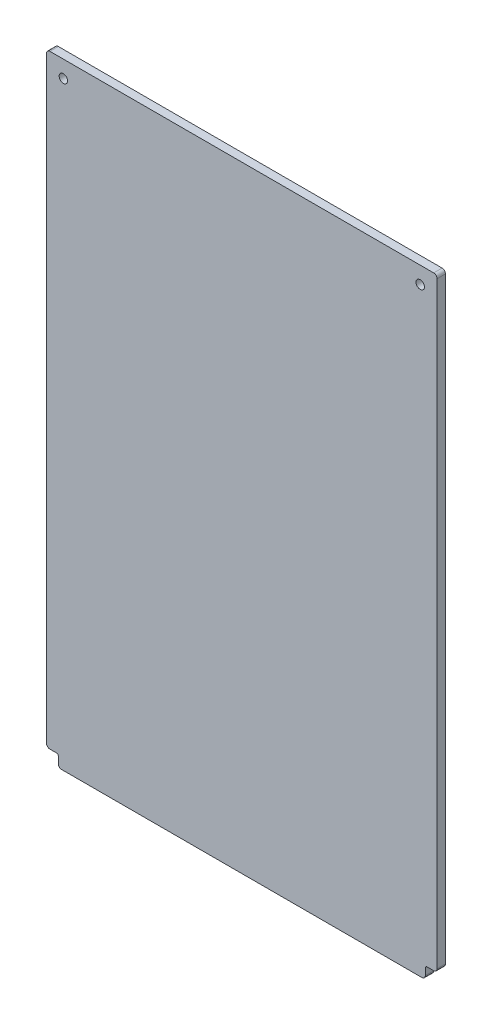
ISO-10303-21;
HEADER;
FILE_DESCRIPTION(('STEP AP214'),'2;1');
FILE_NAME('part.step','',(''),(''),'','','');
FILE_SCHEMA(('AUTOMOTIVE_DESIGN { 1 0 10303 214 1 1 1 1 }'));
ENDSEC;
DATA;
#1=APPLICATION_CONTEXT('core data for automotive mechanical design processes');
#2=APPLICATION_PROTOCOL_DEFINITION('international standard','automotive_design',2000,#1);
#3=PRODUCT_CONTEXT('',#1,'mechanical');
#4=PRODUCT('Part','Part','',(#3));
#5=PRODUCT_RELATED_PRODUCT_CATEGORY('part','',(#4));
#6=PRODUCT_DEFINITION_FORMATION('','',#4);
#7=PRODUCT_DEFINITION_CONTEXT('part definition',#1,'design');
#8=PRODUCT_DEFINITION('design','',#6,#7);
#9=PRODUCT_DEFINITION_SHAPE('','',#8);
#10=(LENGTH_UNIT() NAMED_UNIT(*) SI_UNIT(.MILLI.,.METRE.));
#11=(NAMED_UNIT(*) PLANE_ANGLE_UNIT() SI_UNIT($,.RADIAN.));
#12=(NAMED_UNIT(*) SI_UNIT($,.STERADIAN.) SOLID_ANGLE_UNIT());
#13=UNCERTAINTY_MEASURE_WITH_UNIT(LENGTH_MEASURE(1.E-05),#10,'distance_accuracy_value','');
#14=(GEOMETRIC_REPRESENTATION_CONTEXT(3) GLOBAL_UNCERTAINTY_ASSIGNED_CONTEXT((#13)) GLOBAL_UNIT_ASSIGNED_CONTEXT((#10,
#11,#12)) REPRESENTATION_CONTEXT('',''));
#15=CARTESIAN_POINT('',(0.,0.,0.));
#16=DIRECTION('',(0.,0.,1.));
#17=DIRECTION('',(1.,0.,0.));
#18=AXIS2_PLACEMENT_3D('',#15,#16,#17);
#19=CARTESIAN_POINT('',(0.,0.,6.35));
#20=DIRECTION('',(0.,0.,1.));
#21=DIRECTION('',(1.,0.,0.));
#22=AXIS2_PLACEMENT_3D('',#19,#20,#21);
#23=PLANE('',#22);
#24=CARTESIAN_POINT('',(12.6999999999999,452.12,6.35));
#25=DIRECTION('',(0.,0.,1.));
#26=DIRECTION('',(1.,0.,0.));
#27=AXIS2_PLACEMENT_3D('',#24,#25,#26);
#28=CIRCLE('',#27,3.175);
#29=CARTESIAN_POINT('',(15.8749999999999,452.12,6.35));
#30=VERTEX_POINT('',#29);
#31=EDGE_CURVE('E285',#30,#30,#28,.T.);
#32=ORIENTED_EDGE('',*,*,#31,.F.);
#33=EDGE_LOOP('',(#32));
#34=FACE_BOUND('',#33,.T.);
#35=DIRECTION('',(0.,-1.,0.));
#36=VECTOR('',#35,1.);
#37=CARTESIAN_POINT('',(0.,464.82,6.35));
#38=LINE('',#37,#36);
#39=CARTESIAN_POINT('',(0.,462.28,6.35));
#40=VERTEX_POINT('',#39);
#41=CARTESIAN_POINT('',(0.,11.43,6.35));
#42=VERTEX_POINT('',#41);
#43=EDGE_CURVE('E193',#40,#42,#38,.T.);
#44=ORIENTED_EDGE('',*,*,#43,.T.);
#45=CARTESIAN_POINT('',(2.54,11.43,6.35));
#46=DIRECTION('',(0.,0.,1.));
#47=DIRECTION('',(1.,0.,0.));
#48=AXIS2_PLACEMENT_3D('',#45,#46,#47);
#49=CIRCLE('',#48,2.54);
#50=CARTESIAN_POINT('',(2.54,8.89,6.35));
#51=VERTEX_POINT('',#50);
#52=EDGE_CURVE('E235',#42,#51,#49,.T.);
#53=ORIENTED_EDGE('',*,*,#52,.T.);
#54=DIRECTION('',(1.,0.,0.));
#55=VECTOR('',#54,1.);
#56=CARTESIAN_POINT('',(0.,8.89,6.35));
#57=LINE('',#56,#55);
#58=CARTESIAN_POINT('',(7.62,8.89,6.35));
#59=VERTEX_POINT('',#58);
#60=EDGE_CURVE('E302',#51,#59,#57,.T.);
#61=ORIENTED_EDGE('',*,*,#60,.T.);
#62=CARTESIAN_POINT('',(7.62,7.62,6.35));
#63=DIRECTION('',(0.,0.,1.));
#64=DIRECTION('',(1.,0.,0.));
#65=AXIS2_PLACEMENT_3D('',#62,#63,#64);
#66=CIRCLE('',#65,1.27);
#67=CARTESIAN_POINT('',(8.89,7.62,6.35));
#68=VERTEX_POINT('',#67);
#69=EDGE_CURVE('E158',#59,#68,#66,.F.);
#70=ORIENTED_EDGE('',*,*,#69,.T.);
#71=DIRECTION('',(0.,-1.,0.));
#72=VECTOR('',#71,1.);
#73=CARTESIAN_POINT('',(8.89,8.89,6.35));
#74=LINE('',#73,#72);
#75=CARTESIAN_POINT('',(8.89,2.54,6.35));
#76=VERTEX_POINT('',#75);
#77=EDGE_CURVE('E168',#68,#76,#74,.T.);
#78=ORIENTED_EDGE('',*,*,#77,.T.);
#79=CARTESIAN_POINT('',(11.43,2.54,6.35));
#80=DIRECTION('',(0.,0.,1.));
#81=DIRECTION('',(1.,0.,0.));
#82=AXIS2_PLACEMENT_3D('',#79,#80,#81);
#83=CIRCLE('',#82,2.54);
#84=CARTESIAN_POINT('',(11.43,0.,6.35));
#85=VERTEX_POINT('',#84);
#86=EDGE_CURVE('E233',#76,#85,#83,.T.);
#87=ORIENTED_EDGE('',*,*,#86,.T.);
#88=DIRECTION('',(1.,0.,0.));
#89=VECTOR('',#88,1.);
#90=CARTESIAN_POINT('',(8.89,0.,6.35));
#91=LINE('',#90,#89);
#92=CARTESIAN_POINT('',(283.21,0.,6.35));
#93=VERTEX_POINT('',#92);
#94=EDGE_CURVE('E305',#85,#93,#91,.T.);
#95=ORIENTED_EDGE('',*,*,#94,.T.);
#96=CARTESIAN_POINT('',(283.21,2.54,6.35));
#97=DIRECTION('',(0.,0.,1.));
#98=DIRECTION('',(1.,0.,0.));
#99=AXIS2_PLACEMENT_3D('',#96,#97,#98);
#100=CIRCLE('',#99,2.54);
#101=CARTESIAN_POINT('',(285.75,2.54,6.35));
#102=VERTEX_POINT('',#101);
#103=EDGE_CURVE('E231',#93,#102,#100,.T.);
#104=ORIENTED_EDGE('',*,*,#103,.T.);
#105=DIRECTION('',(0.,1.,0.));
#106=VECTOR('',#105,1.);
#107=CARTESIAN_POINT('',(285.75,0.,6.35));
#108=LINE('',#107,#106);
#109=CARTESIAN_POINT('',(285.75,7.62,6.35));
#110=VERTEX_POINT('',#109);
#111=EDGE_CURVE('E268',#102,#110,#108,.T.);
#112=ORIENTED_EDGE('',*,*,#111,.T.);
#113=CARTESIAN_POINT('',(287.02,7.62,6.35));
#114=DIRECTION('',(0.,0.,1.));
#115=DIRECTION('',(1.,0.,0.));
#116=AXIS2_PLACEMENT_3D('',#113,#114,#115);
#117=CIRCLE('',#116,1.27);
#118=CARTESIAN_POINT('',(287.02,8.89,6.35));
#119=VERTEX_POINT('',#118);
#120=EDGE_CURVE('E205',#110,#119,#117,.F.);
#121=ORIENTED_EDGE('',*,*,#120,.T.);
#122=DIRECTION('',(1.,0.,0.));
#123=VECTOR('',#122,1.);
#124=CARTESIAN_POINT('',(285.75,8.89,6.35));
#125=LINE('',#124,#123);
#126=CARTESIAN_POINT('',(292.1,8.89,6.35));
#127=VERTEX_POINT('',#126);
#128=EDGE_CURVE('E258',#119,#127,#125,.T.);
#129=ORIENTED_EDGE('',*,*,#128,.T.);
#130=CARTESIAN_POINT('',(292.1,11.43,6.35));
#131=DIRECTION('',(0.,0.,1.));
#132=DIRECTION('',(1.,0.,0.));
#133=AXIS2_PLACEMENT_3D('',#130,#131,#132);
#134=CIRCLE('',#133,2.54);
#135=CARTESIAN_POINT('',(294.64,11.43,6.35));
#136=VERTEX_POINT('',#135);
#137=EDGE_CURVE('E229',#127,#136,#134,.T.);
#138=ORIENTED_EDGE('',*,*,#137,.T.);
#139=DIRECTION('',(0.,1.,0.));
#140=VECTOR('',#139,1.);
#141=CARTESIAN_POINT('',(294.64,8.89,6.35));
#142=LINE('',#141,#140);
#143=CARTESIAN_POINT('',(294.64,462.28,6.35));
#144=VERTEX_POINT('',#143);
#145=EDGE_CURVE('E267',#136,#144,#142,.T.);
#146=ORIENTED_EDGE('',*,*,#145,.T.);
#147=CARTESIAN_POINT('',(292.1,462.28,6.35));
#148=DIRECTION('',(0.,0.,1.));
#149=DIRECTION('',(1.,0.,0.));
#150=AXIS2_PLACEMENT_3D('',#147,#148,#149);
#151=CIRCLE('',#150,2.54);
#152=CARTESIAN_POINT('',(292.1,464.82,6.35));
#153=VERTEX_POINT('',#152);
#154=EDGE_CURVE('E54',#144,#153,#151,.T.);
#155=ORIENTED_EDGE('',*,*,#154,.T.);
#156=DIRECTION('',(-1.,0.,0.));
#157=VECTOR('',#156,1.);
#158=CARTESIAN_POINT('',(0.,464.82,6.35));
#159=LINE('',#158,#157);
#160=CARTESIAN_POINT('',(2.53999999999991,464.82,6.35));
#161=VERTEX_POINT('',#160);
#162=EDGE_CURVE('E169',#153,#161,#159,.T.);
#163=ORIENTED_EDGE('',*,*,#162,.T.);
#164=CARTESIAN_POINT('',(2.53999999999991,462.28,6.35));
#165=DIRECTION('',(0.,0.,1.));
#166=DIRECTION('',(1.,0.,0.));
#167=AXIS2_PLACEMENT_3D('',#164,#165,#166);
#168=CIRCLE('',#167,2.54);
#169=EDGE_CURVE('E226',#161,#40,#168,.T.);
#170=ORIENTED_EDGE('',*,*,#169,.T.);
#171=EDGE_LOOP('',(#44,#53,#61,#70,#78,#87,#95,#104,#112,#121,#129,#138,#146,#155,#163,#170));
#172=FACE_BOUND('',#171,.T.);
#173=CARTESIAN_POINT('',(281.94,452.12,6.35));
#174=DIRECTION('',(0.,0.,1.));
#175=DIRECTION('',(1.,0.,0.));
#176=AXIS2_PLACEMENT_3D('',#173,#174,#175);
#177=CIRCLE('',#176,3.17499999999997);
#178=CARTESIAN_POINT('',(285.115,452.12,6.35));
#179=VERTEX_POINT('',#178);
#180=EDGE_CURVE('E295',#179,#179,#177,.T.);
#181=ORIENTED_EDGE('',*,*,#180,.F.);
#182=EDGE_LOOP('',(#181));
#183=FACE_BOUND('',#182,.T.);
#184=ADVANCED_FACE('F33',(#34,#172,#183),#23,.T.);
#185=CARTESIAN_POINT('',(0.,0.,0.));
#186=DIRECTION('',(0.,0.,1.));
#187=DIRECTION('',(1.,0.,0.));
#188=AXIS2_PLACEMENT_3D('',#185,#186,#187);
#189=PLANE('',#188);
#190=DIRECTION('',(1.,0.,0.));
#191=VECTOR('',#190,1.);
#192=CARTESIAN_POINT('',(0.,8.89,0.));
#193=LINE('',#192,#191);
#194=CARTESIAN_POINT('',(2.54,8.89,0.));
#195=VERTEX_POINT('',#194);
#196=CARTESIAN_POINT('',(7.62,8.89,0.));
#197=VERTEX_POINT('',#196);
#198=EDGE_CURVE('E176',#195,#197,#193,.T.);
#199=ORIENTED_EDGE('',*,*,#198,.F.);
#200=CARTESIAN_POINT('',(2.54,11.43,0.));
#201=DIRECTION('',(0.,0.,1.));
#202=DIRECTION('',(1.,0.,0.));
#203=AXIS2_PLACEMENT_3D('',#200,#201,#202);
#204=CIRCLE('',#203,2.54);
#205=CARTESIAN_POINT('',(0.,11.43,0.));
#206=VERTEX_POINT('',#205);
#207=EDGE_CURVE('E219',#195,#206,#204,.F.);
#208=ORIENTED_EDGE('',*,*,#207,.T.);
#209=DIRECTION('',(0.,-1.,0.));
#210=VECTOR('',#209,1.);
#211=CARTESIAN_POINT('',(0.,464.82,0.));
#212=LINE('',#211,#210);
#213=CARTESIAN_POINT('',(0.,462.28,0.));
#214=VERTEX_POINT('',#213);
#215=EDGE_CURVE('E181',#214,#206,#212,.T.);
#216=ORIENTED_EDGE('',*,*,#215,.F.);
#217=CARTESIAN_POINT('',(2.53999999999991,462.28,0.));
#218=DIRECTION('',(0.,0.,1.));
#219=DIRECTION('',(1.,0.,0.));
#220=AXIS2_PLACEMENT_3D('',#217,#218,#219);
#221=CIRCLE('',#220,2.54);
#222=CARTESIAN_POINT('',(2.53999999999991,464.82,0.));
#223=VERTEX_POINT('',#222);
#224=EDGE_CURVE('E210',#214,#223,#221,.F.);
#225=ORIENTED_EDGE('',*,*,#224,.T.);
#226=DIRECTION('',(-1.,0.,0.));
#227=VECTOR('',#226,1.);
#228=CARTESIAN_POINT('',(0.,464.82,0.));
#229=LINE('',#228,#227);
#230=CARTESIAN_POINT('',(292.1,464.82,0.));
#231=VERTEX_POINT('',#230);
#232=EDGE_CURVE('E192',#231,#223,#229,.T.);
#233=ORIENTED_EDGE('',*,*,#232,.F.);
#234=CARTESIAN_POINT('',(292.1,462.28,0.));
#235=DIRECTION('',(0.,0.,1.));
#236=DIRECTION('',(1.,0.,0.));
#237=AXIS2_PLACEMENT_3D('',#234,#235,#236);
#238=CIRCLE('',#237,2.54);
#239=CARTESIAN_POINT('',(294.64,462.28,0.));
#240=VERTEX_POINT('',#239);
#241=EDGE_CURVE('E212',#231,#240,#238,.F.);
#242=ORIENTED_EDGE('',*,*,#241,.T.);
#243=DIRECTION('',(0.,1.,0.));
#244=VECTOR('',#243,1.);
#245=CARTESIAN_POINT('',(294.64,8.89,0.));
#246=LINE('',#245,#244);
#247=CARTESIAN_POINT('',(294.64,11.43,0.));
#248=VERTEX_POINT('',#247);
#249=EDGE_CURVE('E189',#248,#240,#246,.T.);
#250=ORIENTED_EDGE('',*,*,#249,.F.);
#251=CARTESIAN_POINT('',(292.1,11.43,0.));
#252=DIRECTION('',(0.,0.,1.));
#253=DIRECTION('',(1.,0.,0.));
#254=AXIS2_PLACEMENT_3D('',#251,#252,#253);
#255=CIRCLE('',#254,2.54);
#256=CARTESIAN_POINT('',(292.1,8.89,0.));
#257=VERTEX_POINT('',#256);
#258=EDGE_CURVE('E214',#248,#257,#255,.F.);
#259=ORIENTED_EDGE('',*,*,#258,.T.);
#260=DIRECTION('',(1.,0.,0.));
#261=VECTOR('',#260,1.);
#262=CARTESIAN_POINT('',(285.75,8.89,0.));
#263=LINE('',#262,#261);
#264=CARTESIAN_POINT('',(287.02,8.89,0.));
#265=VERTEX_POINT('',#264);
#266=EDGE_CURVE('E186',#265,#257,#263,.T.);
#267=ORIENTED_EDGE('',*,*,#266,.F.);
#268=CARTESIAN_POINT('',(287.02,7.62,0.));
#269=DIRECTION('',(0.,0.,1.));
#270=DIRECTION('',(1.,0.,0.));
#271=AXIS2_PLACEMENT_3D('',#268,#269,#270);
#272=CIRCLE('',#271,1.27);
#273=CARTESIAN_POINT('',(285.75,7.62,0.));
#274=VERTEX_POINT('',#273);
#275=EDGE_CURVE('E202',#265,#274,#272,.T.);
#276=ORIENTED_EDGE('',*,*,#275,.T.);
#277=DIRECTION('',(0.,1.,0.));
#278=VECTOR('',#277,1.);
#279=CARTESIAN_POINT('',(285.75,0.,0.));
#280=LINE('',#279,#278);
#281=CARTESIAN_POINT('',(285.75,2.54,0.));
#282=VERTEX_POINT('',#281);
#283=EDGE_CURVE('E179',#282,#274,#280,.T.);
#284=ORIENTED_EDGE('',*,*,#283,.F.);
#285=CARTESIAN_POINT('',(283.21,2.54,0.));
#286=DIRECTION('',(0.,0.,1.));
#287=DIRECTION('',(1.,0.,0.));
#288=AXIS2_PLACEMENT_3D('',#285,#286,#287);
#289=CIRCLE('',#288,2.54);
#290=CARTESIAN_POINT('',(283.21,0.,0.));
#291=VERTEX_POINT('',#290);
#292=EDGE_CURVE('E216',#282,#291,#289,.F.);
#293=ORIENTED_EDGE('',*,*,#292,.T.);
#294=DIRECTION('',(1.,0.,0.));
#295=VECTOR('',#294,1.);
#296=CARTESIAN_POINT('',(8.89,0.,0.));
#297=LINE('',#296,#295);
#298=CARTESIAN_POINT('',(11.43,0.,0.));
#299=VERTEX_POINT('',#298);
#300=EDGE_CURVE('E175',#299,#291,#297,.T.);
#301=ORIENTED_EDGE('',*,*,#300,.F.);
#302=CARTESIAN_POINT('',(11.43,2.54,0.));
#303=DIRECTION('',(0.,0.,1.));
#304=DIRECTION('',(1.,0.,0.));
#305=AXIS2_PLACEMENT_3D('',#302,#303,#304);
#306=CIRCLE('',#305,2.54);
#307=CARTESIAN_POINT('',(8.89,2.54,0.));
#308=VERTEX_POINT('',#307);
#309=EDGE_CURVE('E174',#299,#308,#306,.F.);
#310=ORIENTED_EDGE('',*,*,#309,.T.);
#311=DIRECTION('',(0.,-1.,0.));
#312=VECTOR('',#311,1.);
#313=CARTESIAN_POINT('',(8.89,8.89,0.));
#314=LINE('',#313,#312);
#315=CARTESIAN_POINT('',(8.89,7.62,0.));
#316=VERTEX_POINT('',#315);
#317=EDGE_CURVE('E165',#316,#308,#314,.T.);
#318=ORIENTED_EDGE('',*,*,#317,.F.);
#319=CARTESIAN_POINT('',(7.62,7.62,0.));
#320=DIRECTION('',(0.,0.,1.));
#321=DIRECTION('',(1.,0.,0.));
#322=AXIS2_PLACEMENT_3D('',#319,#320,#321);
#323=CIRCLE('',#322,1.27);
#324=EDGE_CURVE('E148',#316,#197,#323,.T.);
#325=ORIENTED_EDGE('',*,*,#324,.T.);
#326=EDGE_LOOP('',(#199,#208,#216,#225,#233,#242,#250,#259,#267,#276,#284,#293,#301,#310,#318,#325));
#327=FACE_BOUND('',#326,.T.);
#328=CARTESIAN_POINT('',(12.6999999999999,452.12,0.));
#329=DIRECTION('',(0.,0.,1.));
#330=DIRECTION('',(1.,0.,0.));
#331=AXIS2_PLACEMENT_3D('',#328,#329,#330);
#332=CIRCLE('',#331,3.175);
#333=CARTESIAN_POINT('',(15.8749999999999,452.12,0.));
#334=VERTEX_POINT('',#333);
#335=EDGE_CURVE('E290',#334,#334,#332,.T.);
#336=ORIENTED_EDGE('',*,*,#335,.T.);
#337=EDGE_LOOP('',(#336));
#338=FACE_BOUND('',#337,.T.);
#339=CARTESIAN_POINT('',(281.94,452.12,0.));
#340=DIRECTION('',(0.,0.,1.));
#341=DIRECTION('',(1.,0.,0.));
#342=AXIS2_PLACEMENT_3D('',#339,#340,#341);
#343=CIRCLE('',#342,3.17499999999997);
#344=CARTESIAN_POINT('',(285.115,452.12,0.));
#345=VERTEX_POINT('',#344);
#346=EDGE_CURVE('E298',#345,#345,#343,.T.);
#347=ORIENTED_EDGE('',*,*,#346,.T.);
#348=EDGE_LOOP('',(#347));
#349=FACE_BOUND('',#348,.T.);
#350=ADVANCED_FACE('F171',(#327,#338,#349),#189,.F.);
#351=CARTESIAN_POINT('',(0.,464.82,6.35));
#352=DIRECTION('',(1.,0.,0.));
#353=DIRECTION('',(0.,1.,0.));
#354=AXIS2_PLACEMENT_3D('',#351,#352,#353);
#355=PLANE('',#354);
#356=ORIENTED_EDGE('',*,*,#215,.T.);
#357=DIRECTION('',(0.,0.,-1.));
#358=VECTOR('',#357,1.);
#359=CARTESIAN_POINT('',(0.,11.43,6.35));
#360=LINE('',#359,#358);
#361=EDGE_CURVE('E224',#206,#42,#360,.F.);
#362=ORIENTED_EDGE('',*,*,#361,.T.);
#363=ORIENTED_EDGE('',*,*,#43,.F.);
#364=DIRECTION('',(0.,0.,-1.));
#365=VECTOR('',#364,1.);
#366=CARTESIAN_POINT('',(0.,462.28,6.35));
#367=LINE('',#366,#365);
#368=EDGE_CURVE('E221',#40,#214,#367,.T.);
#369=ORIENTED_EDGE('',*,*,#368,.T.);
#370=EDGE_LOOP('',(#356,#362,#363,#369));
#371=FACE_BOUND('',#370,.T.);
#372=ADVANCED_FACE('F341',(#371),#355,.F.);
#373=CARTESIAN_POINT('',(0.,8.89,6.35));
#374=DIRECTION('',(0.,1.,0.));
#375=DIRECTION('',(0.,0.,1.));
#376=AXIS2_PLACEMENT_3D('',#373,#374,#375);
#377=PLANE('',#376);
#378=ORIENTED_EDGE('',*,*,#60,.F.);
#379=DIRECTION('',(0.,0.,-1.));
#380=VECTOR('',#379,1.);
#381=CARTESIAN_POINT('',(2.54,8.89,6.35));
#382=LINE('',#381,#380);
#383=EDGE_CURVE('E207',#51,#195,#382,.T.);
#384=ORIENTED_EDGE('',*,*,#383,.T.);
#385=ORIENTED_EDGE('',*,*,#198,.T.);
#386=DIRECTION('',(0.,0.,-1.));
#387=VECTOR('',#386,1.);
#388=CARTESIAN_POINT('',(7.62,8.89,6.35));
#389=LINE('',#388,#387);
#390=EDGE_CURVE('E154',#197,#59,#389,.F.);
#391=ORIENTED_EDGE('',*,*,#390,.T.);
#392=EDGE_LOOP('',(#378,#384,#385,#391));
#393=FACE_BOUND('',#392,.T.);
#394=ADVANCED_FACE('F359',(#393),#377,.F.);
#395=CARTESIAN_POINT('',(8.89,8.89,6.35));
#396=DIRECTION('',(1.,0.,0.));
#397=DIRECTION('',(0.,0.,-1.));
#398=AXIS2_PLACEMENT_3D('',#395,#396,#397);
#399=PLANE('',#398);
#400=ORIENTED_EDGE('',*,*,#317,.T.);
#401=DIRECTION('',(0.,0.,-1.));
#402=VECTOR('',#401,1.);
#403=CARTESIAN_POINT('',(8.89,2.54,6.35));
#404=LINE('',#403,#402);
#405=EDGE_CURVE('E242',#308,#76,#404,.F.);
#406=ORIENTED_EDGE('',*,*,#405,.T.);
#407=ORIENTED_EDGE('',*,*,#77,.F.);
#408=DIRECTION('',(0.,0.,-1.));
#409=VECTOR('',#408,1.);
#410=CARTESIAN_POINT('',(8.89,7.62,0.));
#411=LINE('',#410,#409);
#412=EDGE_CURVE('E152',#68,#316,#411,.T.);
#413=ORIENTED_EDGE('',*,*,#412,.T.);
#414=EDGE_LOOP('',(#400,#406,#407,#413));
#415=FACE_BOUND('',#414,.T.);
#416=ADVANCED_FACE('F164',(#415),#399,.F.);
#417=CARTESIAN_POINT('',(8.89,0.,6.35));
#418=DIRECTION('',(0.,1.,0.));
#419=DIRECTION('',(0.,0.,1.));
#420=AXIS2_PLACEMENT_3D('',#417,#418,#419);
#421=PLANE('',#420);
#422=ORIENTED_EDGE('',*,*,#94,.F.);
#423=DIRECTION('',(0.,0.,-1.));
#424=VECTOR('',#423,1.);
#425=CARTESIAN_POINT('',(11.43,0.,6.35));
#426=LINE('',#425,#424);
#427=EDGE_CURVE('E239',#85,#299,#426,.T.);
#428=ORIENTED_EDGE('',*,*,#427,.T.);
#429=ORIENTED_EDGE('',*,*,#300,.T.);
#430=DIRECTION('',(0.,0.,-1.));
#431=VECTOR('',#430,1.);
#432=CARTESIAN_POINT('',(283.21,0.,6.35));
#433=LINE('',#432,#431);
#434=EDGE_CURVE('E237',#291,#93,#433,.F.);
#435=ORIENTED_EDGE('',*,*,#434,.T.);
#436=EDGE_LOOP('',(#422,#428,#429,#435));
#437=FACE_BOUND('',#436,.T.);
#438=ADVANCED_FACE('F321',(#437),#421,.F.);
#439=CARTESIAN_POINT('',(285.75,0.,6.35));
#440=DIRECTION('',(-1.,0.,0.));
#441=DIRECTION('',(0.,0.,1.));
#442=AXIS2_PLACEMENT_3D('',#439,#440,#441);
#443=PLANE('',#442);
#444=ORIENTED_EDGE('',*,*,#111,.F.);
#445=DIRECTION('',(0.,0.,-1.));
#446=VECTOR('',#445,1.);
#447=CARTESIAN_POINT('',(285.75,2.54,6.35));
#448=LINE('',#447,#446);
#449=EDGE_CURVE('E244',#102,#282,#448,.T.);
#450=ORIENTED_EDGE('',*,*,#449,.T.);
#451=ORIENTED_EDGE('',*,*,#283,.T.);
#452=DIRECTION('',(0.,0.,-1.));
#453=VECTOR('',#452,1.);
#454=CARTESIAN_POINT('',(285.75,7.62,6.35));
#455=LINE('',#454,#453);
#456=EDGE_CURVE('E159',#274,#110,#455,.F.);
#457=ORIENTED_EDGE('',*,*,#456,.T.);
#458=EDGE_LOOP('',(#444,#450,#451,#457));
#459=FACE_BOUND('',#458,.T.);
#460=ADVANCED_FACE('F313',(#459),#443,.F.);
#461=CARTESIAN_POINT('',(285.75,8.89,6.35));
#462=DIRECTION('',(0.,1.,0.));
#463=DIRECTION('',(0.,0.,1.));
#464=AXIS2_PLACEMENT_3D('',#461,#462,#463);
#465=PLANE('',#464);
#466=ORIENTED_EDGE('',*,*,#266,.T.);
#467=DIRECTION('',(0.,0.,-1.));
#468=VECTOR('',#467,1.);
#469=CARTESIAN_POINT('',(292.1,8.89,6.35));
#470=LINE('',#469,#468);
#471=EDGE_CURVE('E252',#257,#127,#470,.F.);
#472=ORIENTED_EDGE('',*,*,#471,.T.);
#473=ORIENTED_EDGE('',*,*,#128,.F.);
#474=DIRECTION('',(0.,0.,-1.));
#475=VECTOR('',#474,1.);
#476=CARTESIAN_POINT('',(287.02,8.89,0.));
#477=LINE('',#476,#475);
#478=EDGE_CURVE('E196',#119,#265,#477,.T.);
#479=ORIENTED_EDGE('',*,*,#478,.T.);
#480=EDGE_LOOP('',(#466,#472,#473,#479));
#481=FACE_BOUND('',#480,.T.);
#482=ADVANCED_FACE('F257',(#481),#465,.F.);
#483=CARTESIAN_POINT('',(294.64,8.89,6.35));
#484=DIRECTION('',(-1.,0.,0.));
#485=DIRECTION('',(0.,0.,1.));
#486=AXIS2_PLACEMENT_3D('',#483,#484,#485);
#487=PLANE('',#486);
#488=ORIENTED_EDGE('',*,*,#145,.F.);
#489=DIRECTION('',(0.,0.,-1.));
#490=VECTOR('',#489,1.);
#491=CARTESIAN_POINT('',(294.64,11.43,6.35));
#492=LINE('',#491,#490);
#493=EDGE_CURVE('E249',#136,#248,#492,.T.);
#494=ORIENTED_EDGE('',*,*,#493,.T.);
#495=ORIENTED_EDGE('',*,*,#249,.T.);
#496=DIRECTION('',(0.,0.,-1.));
#497=VECTOR('',#496,1.);
#498=CARTESIAN_POINT('',(294.64,462.28,6.35));
#499=LINE('',#498,#497);
#500=EDGE_CURVE('E247',#240,#144,#499,.F.);
#501=ORIENTED_EDGE('',*,*,#500,.T.);
#502=EDGE_LOOP('',(#488,#494,#495,#501));
#503=FACE_BOUND('',#502,.T.);
#504=ADVANCED_FACE('F274',(#503),#487,.F.);
#505=CARTESIAN_POINT('',(0.,464.82,6.35));
#506=DIRECTION('',(0.,-1.,0.));
#507=DIRECTION('',(0.,0.,-1.));
#508=AXIS2_PLACEMENT_3D('',#505,#506,#507);
#509=PLANE('',#508);
#510=ORIENTED_EDGE('',*,*,#162,.F.);
#511=DIRECTION('',(0.,0.,-1.));
#512=VECTOR('',#511,1.);
#513=CARTESIAN_POINT('',(292.1,464.82,6.35));
#514=LINE('',#513,#512);
#515=EDGE_CURVE('E11',#153,#231,#514,.T.);
#516=ORIENTED_EDGE('',*,*,#515,.T.);
#517=ORIENTED_EDGE('',*,*,#232,.T.);
#518=DIRECTION('',(0.,0.,-1.));
#519=VECTOR('',#518,1.);
#520=CARTESIAN_POINT('',(2.53999999999991,464.82,6.35));
#521=LINE('',#520,#519);
#522=EDGE_CURVE('E41',#223,#161,#521,.F.);
#523=ORIENTED_EDGE('',*,*,#522,.T.);
#524=EDGE_LOOP('',(#510,#516,#517,#523));
#525=FACE_BOUND('',#524,.T.);
#526=ADVANCED_FACE('F280',(#525),#509,.F.);
#527=CARTESIAN_POINT('',(12.6999999999999,452.12,6.35));
#528=DIRECTION('',(0.,0.,-1.));
#529=DIRECTION('',(-1.,0.,0.));
#530=AXIS2_PLACEMENT_3D('',#527,#528,#529);
#531=CYLINDRICAL_SURFACE('',#530,3.175);
#532=ORIENTED_EDGE('',*,*,#31,.T.);
#533=EDGE_LOOP('',(#532));
#534=FACE_BOUND('',#533,.T.);
#535=ORIENTED_EDGE('',*,*,#335,.F.);
#536=EDGE_LOOP('',(#535));
#537=FACE_BOUND('',#536,.T.);
#538=ADVANCED_FACE('F344',(#534,#537),#531,.F.);
#539=CARTESIAN_POINT('',(281.94,452.12,6.35));
#540=DIRECTION('',(0.,0.,-1.));
#541=DIRECTION('',(-1.,0.,0.));
#542=AXIS2_PLACEMENT_3D('',#539,#540,#541);
#543=CYLINDRICAL_SURFACE('',#542,3.17499999999997);
#544=ORIENTED_EDGE('',*,*,#180,.T.);
#545=EDGE_LOOP('',(#544));
#546=FACE_BOUND('',#545,.T.);
#547=ORIENTED_EDGE('',*,*,#346,.F.);
#548=EDGE_LOOP('',(#547));
#549=FACE_BOUND('',#548,.T.);
#550=ADVANCED_FACE('F367',(#546,#549),#543,.F.);
#551=CARTESIAN_POINT('',(7.62,7.62,6.35));
#552=DIRECTION('',(0.,0.,1.));
#553=DIRECTION('',(1.,0.,0.));
#554=AXIS2_PLACEMENT_3D('',#551,#552,#553);
#555=CYLINDRICAL_SURFACE('',#554,1.27);
#556=ORIENTED_EDGE('',*,*,#69,.F.);
#557=ORIENTED_EDGE('',*,*,#390,.F.);
#558=ORIENTED_EDGE('',*,*,#324,.F.);
#559=ORIENTED_EDGE('',*,*,#412,.F.);
#560=EDGE_LOOP('',(#556,#557,#558,#559));
#561=FACE_BOUND('',#560,.T.);
#562=ADVANCED_FACE('F151',(#561),#555,.F.);
#563=CARTESIAN_POINT('',(287.02,7.62,6.35));
#564=DIRECTION('',(0.,0.,1.));
#565=DIRECTION('',(1.,0.,0.));
#566=AXIS2_PLACEMENT_3D('',#563,#564,#565);
#567=CYLINDRICAL_SURFACE('',#566,1.27);
#568=ORIENTED_EDGE('',*,*,#120,.F.);
#569=ORIENTED_EDGE('',*,*,#456,.F.);
#570=ORIENTED_EDGE('',*,*,#275,.F.);
#571=ORIENTED_EDGE('',*,*,#478,.F.);
#572=EDGE_LOOP('',(#568,#569,#570,#571));
#573=FACE_BOUND('',#572,.T.);
#574=ADVANCED_FACE('F316',(#573),#567,.F.);
#575=CARTESIAN_POINT('',(2.54,11.43,6.35));
#576=DIRECTION('',(0.,0.,-1.));
#577=DIRECTION('',(-1.,0.,0.));
#578=AXIS2_PLACEMENT_3D('',#575,#576,#577);
#579=CYLINDRICAL_SURFACE('',#578,2.54);
#580=ORIENTED_EDGE('',*,*,#52,.F.);
#581=ORIENTED_EDGE('',*,*,#361,.F.);
#582=ORIENTED_EDGE('',*,*,#207,.F.);
#583=ORIENTED_EDGE('',*,*,#383,.F.);
#584=EDGE_LOOP('',(#580,#581,#582,#583));
#585=FACE_BOUND('',#584,.T.);
#586=ADVANCED_FACE('F332',(#585),#579,.T.);
#587=CARTESIAN_POINT('',(11.43,2.54,6.35));
#588=DIRECTION('',(0.,0.,-1.));
#589=DIRECTION('',(-1.,0.,0.));
#590=AXIS2_PLACEMENT_3D('',#587,#588,#589);
#591=CYLINDRICAL_SURFACE('',#590,2.54);
#592=ORIENTED_EDGE('',*,*,#86,.F.);
#593=ORIENTED_EDGE('',*,*,#405,.F.);
#594=ORIENTED_EDGE('',*,*,#309,.F.);
#595=ORIENTED_EDGE('',*,*,#427,.F.);
#596=EDGE_LOOP('',(#592,#593,#594,#595));
#597=FACE_BOUND('',#596,.T.);
#598=ADVANCED_FACE('F325',(#597),#591,.T.);
#599=CARTESIAN_POINT('',(283.21,2.54,6.35));
#600=DIRECTION('',(0.,0.,-1.));
#601=DIRECTION('',(-1.,0.,0.));
#602=AXIS2_PLACEMENT_3D('',#599,#600,#601);
#603=CYLINDRICAL_SURFACE('',#602,2.54);
#604=ORIENTED_EDGE('',*,*,#103,.F.);
#605=ORIENTED_EDGE('',*,*,#434,.F.);
#606=ORIENTED_EDGE('',*,*,#292,.F.);
#607=ORIENTED_EDGE('',*,*,#449,.F.);
#608=EDGE_LOOP('',(#604,#605,#606,#607));
#609=FACE_BOUND('',#608,.T.);
#610=ADVANCED_FACE('F323',(#609),#603,.T.);
#611=CARTESIAN_POINT('',(292.1,11.43,6.35));
#612=DIRECTION('',(0.,0.,-1.));
#613=DIRECTION('',(-1.,0.,0.));
#614=AXIS2_PLACEMENT_3D('',#611,#612,#613);
#615=CYLINDRICAL_SURFACE('',#614,2.54);
#616=ORIENTED_EDGE('',*,*,#137,.F.);
#617=ORIENTED_EDGE('',*,*,#471,.F.);
#618=ORIENTED_EDGE('',*,*,#258,.F.);
#619=ORIENTED_EDGE('',*,*,#493,.F.);
#620=EDGE_LOOP('',(#616,#617,#618,#619));
#621=FACE_BOUND('',#620,.T.);
#622=ADVANCED_FACE('F271',(#621),#615,.T.);
#623=CARTESIAN_POINT('',(292.1,462.28,6.35));
#624=DIRECTION('',(0.,0.,-1.));
#625=DIRECTION('',(-1.,0.,0.));
#626=AXIS2_PLACEMENT_3D('',#623,#624,#625);
#627=CYLINDRICAL_SURFACE('',#626,2.54);
#628=ORIENTED_EDGE('',*,*,#154,.F.);
#629=ORIENTED_EDGE('',*,*,#500,.F.);
#630=ORIENTED_EDGE('',*,*,#241,.F.);
#631=ORIENTED_EDGE('',*,*,#515,.F.);
#632=EDGE_LOOP('',(#628,#629,#630,#631));
#633=FACE_BOUND('',#632,.T.);
#634=ADVANCED_FACE('F279',(#633),#627,.T.);
#635=CARTESIAN_POINT('',(2.53999999999991,462.28,6.35));
#636=DIRECTION('',(0.,0.,-1.));
#637=DIRECTION('',(-1.,0.,0.));
#638=AXIS2_PLACEMENT_3D('',#635,#636,#637);
#639=CYLINDRICAL_SURFACE('',#638,2.54);
#640=ORIENTED_EDGE('',*,*,#169,.F.);
#641=ORIENTED_EDGE('',*,*,#522,.F.);
#642=ORIENTED_EDGE('',*,*,#224,.F.);
#643=ORIENTED_EDGE('',*,*,#368,.F.);
#644=EDGE_LOOP('',(#640,#641,#642,#643));
#645=FACE_BOUND('',#644,.T.);
#646=ADVANCED_FACE('F35',(#645),#639,.T.);
#647=CLOSED_SHELL('',(#184,#350,#372,#394,#416,#438,#460,#482,#504,#526,#538,#550,#562,#574,
#586,#598,#610,#622,#634,#646));
#648=MANIFOLD_SOLID_BREP('B2',#647);
#649=ADVANCED_BREP_SHAPE_REPRESENTATION('',(#18,#648),#14);
#650=SHAPE_DEFINITION_REPRESENTATION(#9,#649);
ENDSEC;
END-ISO-10303-21;
